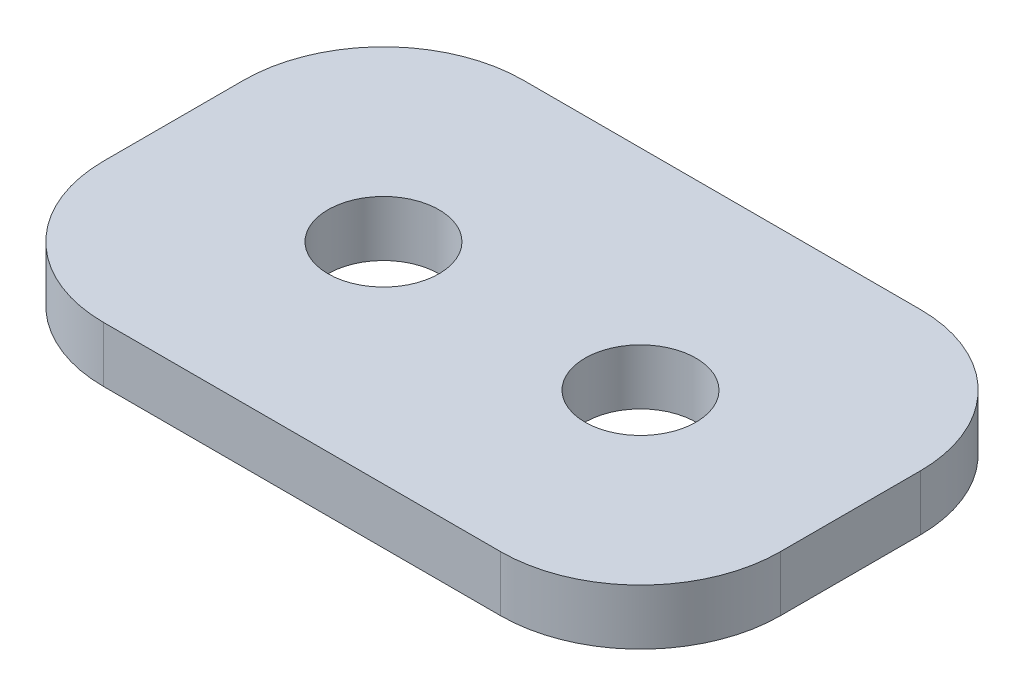
ISO-10303-21;
HEADER;
FILE_DESCRIPTION(('STEP AP214'),'2;1');
FILE_NAME('part.step','',(''),(''),'','','');
FILE_SCHEMA(('AUTOMOTIVE_DESIGN { 1 0 10303 214 1 1 1 1 }'));
ENDSEC;
DATA;
#1=APPLICATION_CONTEXT('core data for automotive mechanical design processes');
#2=APPLICATION_PROTOCOL_DEFINITION('international standard','automotive_design',2000,#1);
#3=PRODUCT_CONTEXT('',#1,'mechanical');
#4=PRODUCT('Part','Part','',(#3));
#5=PRODUCT_RELATED_PRODUCT_CATEGORY('part','',(#4));
#6=PRODUCT_DEFINITION_FORMATION('','',#4);
#7=PRODUCT_DEFINITION_CONTEXT('part definition',#1,'design');
#8=PRODUCT_DEFINITION('design','',#6,#7);
#9=PRODUCT_DEFINITION_SHAPE('','',#8);
#10=(LENGTH_UNIT() NAMED_UNIT(*) SI_UNIT(.MILLI.,.METRE.));
#11=(NAMED_UNIT(*) PLANE_ANGLE_UNIT() SI_UNIT($,.RADIAN.));
#12=(NAMED_UNIT(*) SI_UNIT($,.STERADIAN.) SOLID_ANGLE_UNIT());
#13=UNCERTAINTY_MEASURE_WITH_UNIT(LENGTH_MEASURE(1.E-05),#10,'distance_accuracy_value','');
#14=(GEOMETRIC_REPRESENTATION_CONTEXT(3) GLOBAL_UNCERTAINTY_ASSIGNED_CONTEXT((#13)) GLOBAL_UNIT_ASSIGNED_CONTEXT((#10,
#11,#12)) REPRESENTATION_CONTEXT('',''));
#15=CARTESIAN_POINT('',(0.,0.,0.));
#16=DIRECTION('',(0.,0.,1.));
#17=DIRECTION('',(1.,0.,0.));
#18=AXIS2_PLACEMENT_3D('',#15,#16,#17);
#19=CARTESIAN_POINT('',(0.,0.79375,0.));
#20=DIRECTION('',(0.,1.,0.));
#21=DIRECTION('',(0.,0.,1.));
#22=AXIS2_PLACEMENT_3D('',#19,#20,#21);
#23=PLANE('',#22);
#24=CARTESIAN_POINT('',(-3.675,0.79375,0.));
#25=DIRECTION('',(0.,1.,0.));
#26=DIRECTION('',(0.,0.,1.));
#27=AXIS2_PLACEMENT_3D('',#24,#25,#26);
#28=CIRCLE('',#27,1.5875);
#29=CARTESIAN_POINT('',(-3.675,0.79375,1.5875));
#30=VERTEX_POINT('',#29);
#31=EDGE_CURVE('E126',#30,#30,#28,.T.);
#32=ORIENTED_EDGE('',*,*,#31,.F.);
#33=EDGE_LOOP('',(#32));
#34=FACE_BOUND('',#33,.T.);
#35=DIRECTION('',(-1.,0.,0.));
#36=VECTOR('',#35,1.);
#37=CARTESIAN_POINT('',(9.675,0.79375,-6.));
#38=LINE('',#37,#36);
#39=CARTESIAN_POINT('',(5.675,0.79375,-6.));
#40=VERTEX_POINT('',#39);
#41=CARTESIAN_POINT('',(-5.675,0.79375,-6.));
#42=VERTEX_POINT('',#41);
#43=EDGE_CURVE('E135',#40,#42,#38,.T.);
#44=ORIENTED_EDGE('',*,*,#43,.T.);
#45=CARTESIAN_POINT('',(-5.675,0.79375,-2.));
#46=DIRECTION('',(0.,1.,0.));
#47=DIRECTION('',(0.,0.,1.));
#48=AXIS2_PLACEMENT_3D('',#45,#46,#47);
#49=CIRCLE('',#48,4.);
#50=CARTESIAN_POINT('',(-9.675,0.79375,-2.));
#51=VERTEX_POINT('',#50);
#52=EDGE_CURVE('E154',#42,#51,#49,.T.);
#53=ORIENTED_EDGE('',*,*,#52,.T.);
#54=DIRECTION('',(0.,0.,1.));
#55=VECTOR('',#54,1.);
#56=CARTESIAN_POINT('',(-9.675,0.79375,6.));
#57=LINE('',#56,#55);
#58=CARTESIAN_POINT('',(-9.675,0.79375,2.));
#59=VERTEX_POINT('',#58);
#60=EDGE_CURVE('E118',#51,#59,#57,.T.);
#61=ORIENTED_EDGE('',*,*,#60,.T.);
#62=CARTESIAN_POINT('',(-5.675,0.79375,2.));
#63=DIRECTION('',(0.,1.,0.));
#64=DIRECTION('',(0.,0.,1.));
#65=AXIS2_PLACEMENT_3D('',#62,#63,#64);
#66=CIRCLE('',#65,4.);
#67=CARTESIAN_POINT('',(-5.675,0.79375,6.));
#68=VERTEX_POINT('',#67);
#69=EDGE_CURVE('E152',#59,#68,#66,.T.);
#70=ORIENTED_EDGE('',*,*,#69,.T.);
#71=DIRECTION('',(1.,0.,0.));
#72=VECTOR('',#71,1.);
#73=CARTESIAN_POINT('',(9.675,0.79375,6.));
#74=LINE('',#73,#72);
#75=CARTESIAN_POINT('',(5.675,0.79375,6.));
#76=VERTEX_POINT('',#75);
#77=EDGE_CURVE('E174',#68,#76,#74,.T.);
#78=ORIENTED_EDGE('',*,*,#77,.T.);
#79=CARTESIAN_POINT('',(5.675,0.79375,2.));
#80=DIRECTION('',(0.,1.,0.));
#81=DIRECTION('',(0.,0.,1.));
#82=AXIS2_PLACEMENT_3D('',#79,#80,#81);
#83=CIRCLE('',#82,4.);
#84=CARTESIAN_POINT('',(9.675,0.79375,2.));
#85=VERTEX_POINT('',#84);
#86=EDGE_CURVE('E53',#76,#85,#83,.T.);
#87=ORIENTED_EDGE('',*,*,#86,.T.);
#88=DIRECTION('',(0.,0.,-1.));
#89=VECTOR('',#88,1.);
#90=CARTESIAN_POINT('',(9.675,0.79375,6.));
#91=LINE('',#90,#89);
#92=CARTESIAN_POINT('',(9.675,0.79375,-2.));
#93=VERTEX_POINT('',#92);
#94=EDGE_CURVE('E164',#85,#93,#91,.T.);
#95=ORIENTED_EDGE('',*,*,#94,.T.);
#96=CARTESIAN_POINT('',(5.675,0.79375,-2.));
#97=DIRECTION('',(0.,1.,0.));
#98=DIRECTION('',(0.,0.,1.));
#99=AXIS2_PLACEMENT_3D('',#96,#97,#98);
#100=CIRCLE('',#99,4.);
#101=EDGE_CURVE('E150',#93,#40,#100,.T.);
#102=ORIENTED_EDGE('',*,*,#101,.T.);
#103=EDGE_LOOP('',(#44,#53,#61,#70,#78,#87,#95,#102));
#104=FACE_BOUND('',#103,.T.);
#105=CARTESIAN_POINT('',(3.675,0.79375,0.));
#106=DIRECTION('',(0.,1.,0.));
#107=DIRECTION('',(0.,0.,1.));
#108=AXIS2_PLACEMENT_3D('',#105,#106,#107);
#109=CIRCLE('',#108,1.5875);
#110=CARTESIAN_POINT('',(3.675,0.79375,1.5875));
#111=VERTEX_POINT('',#110);
#112=EDGE_CURVE('E179',#111,#111,#109,.T.);
#113=ORIENTED_EDGE('',*,*,#112,.F.);
#114=EDGE_LOOP('',(#113));
#115=FACE_BOUND('',#114,.T.);
#116=ADVANCED_FACE('F33',(#34,#104,#115),#23,.T.);
#117=CARTESIAN_POINT('',(0.,-0.79375,0.));
#118=DIRECTION('',(0.,1.,0.));
#119=DIRECTION('',(0.,0.,1.));
#120=AXIS2_PLACEMENT_3D('',#117,#118,#119);
#121=PLANE('',#120);
#122=CARTESIAN_POINT('',(-3.675,-0.79375,0.));
#123=DIRECTION('',(0.,1.,0.));
#124=DIRECTION('',(0.,0.,1.));
#125=AXIS2_PLACEMENT_3D('',#122,#123,#124);
#126=CIRCLE('',#125,1.5875);
#127=CARTESIAN_POINT('',(-3.675,-0.79375,1.5875));
#128=VERTEX_POINT('',#127);
#129=EDGE_CURVE('E132',#128,#128,#126,.T.);
#130=ORIENTED_EDGE('',*,*,#129,.T.);
#131=EDGE_LOOP('',(#130));
#132=FACE_BOUND('',#131,.T.);
#133=DIRECTION('',(0.,0.,1.));
#134=VECTOR('',#133,1.);
#135=CARTESIAN_POINT('',(-9.675,-0.79375,6.));
#136=LINE('',#135,#134);
#137=CARTESIAN_POINT('',(-9.675,-0.79375,-2.));
#138=VERTEX_POINT('',#137);
#139=CARTESIAN_POINT('',(-9.675,-0.79375,2.));
#140=VERTEX_POINT('',#139);
#141=EDGE_CURVE('E115',#138,#140,#136,.T.);
#142=ORIENTED_EDGE('',*,*,#141,.F.);
#143=CARTESIAN_POINT('',(-5.675,-0.79375,-2.));
#144=DIRECTION('',(0.,1.,0.));
#145=DIRECTION('',(0.,0.,1.));
#146=AXIS2_PLACEMENT_3D('',#143,#144,#145);
#147=CIRCLE('',#146,4.);
#148=CARTESIAN_POINT('',(-5.675,-0.79375,-6.));
#149=VERTEX_POINT('',#148);
#150=EDGE_CURVE('E98',#138,#149,#147,.F.);
#151=ORIENTED_EDGE('',*,*,#150,.T.);
#152=DIRECTION('',(-1.,0.,0.));
#153=VECTOR('',#152,1.);
#154=CARTESIAN_POINT('',(9.675,-0.79375,-6.));
#155=LINE('',#154,#153);
#156=CARTESIAN_POINT('',(5.675,-0.79375,-6.));
#157=VERTEX_POINT('',#156);
#158=EDGE_CURVE('E139',#157,#149,#155,.T.);
#159=ORIENTED_EDGE('',*,*,#158,.F.);
#160=CARTESIAN_POINT('',(5.675,-0.79375,-2.));
#161=DIRECTION('',(0.,1.,0.));
#162=DIRECTION('',(0.,0.,1.));
#163=AXIS2_PLACEMENT_3D('',#160,#161,#162);
#164=CIRCLE('',#163,4.);
#165=CARTESIAN_POINT('',(9.675,-0.79375,-2.));
#166=VERTEX_POINT('',#165);
#167=EDGE_CURVE('E143',#157,#166,#164,.F.);
#168=ORIENTED_EDGE('',*,*,#167,.T.);
#169=DIRECTION('',(0.,0.,-1.));
#170=VECTOR('',#169,1.);
#171=CARTESIAN_POINT('',(9.675,-0.79375,6.));
#172=LINE('',#171,#170);
#173=CARTESIAN_POINT('',(9.675,-0.79375,2.));
#174=VERTEX_POINT('',#173);
#175=EDGE_CURVE('E129',#174,#166,#172,.T.);
#176=ORIENTED_EDGE('',*,*,#175,.F.);
#177=CARTESIAN_POINT('',(5.675,-0.79375,2.));
#178=DIRECTION('',(0.,1.,0.));
#179=DIRECTION('',(0.,0.,1.));
#180=AXIS2_PLACEMENT_3D('',#177,#178,#179);
#181=CIRCLE('',#180,4.);
#182=CARTESIAN_POINT('',(5.675,-0.79375,6.));
#183=VERTEX_POINT('',#182);
#184=EDGE_CURVE('E119',#174,#183,#181,.F.);
#185=ORIENTED_EDGE('',*,*,#184,.T.);
#186=DIRECTION('',(1.,0.,0.));
#187=VECTOR('',#186,1.);
#188=CARTESIAN_POINT('',(9.675,-0.79375,6.));
#189=LINE('',#188,#187);
#190=CARTESIAN_POINT('',(-5.675,-0.79375,6.));
#191=VERTEX_POINT('',#190);
#192=EDGE_CURVE('E125',#191,#183,#189,.T.);
#193=ORIENTED_EDGE('',*,*,#192,.F.);
#194=CARTESIAN_POINT('',(-5.675,-0.79375,2.));
#195=DIRECTION('',(0.,1.,0.));
#196=DIRECTION('',(0.,0.,1.));
#197=AXIS2_PLACEMENT_3D('',#194,#195,#196);
#198=CIRCLE('',#197,4.);
#199=EDGE_CURVE('E109',#191,#140,#198,.F.);
#200=ORIENTED_EDGE('',*,*,#199,.T.);
#201=EDGE_LOOP('',(#142,#151,#159,#168,#176,#185,#193,#200));
#202=FACE_BOUND('',#201,.T.);
#203=CARTESIAN_POINT('',(3.675,-0.79375,0.));
#204=DIRECTION('',(0.,1.,0.));
#205=DIRECTION('',(0.,0.,1.));
#206=AXIS2_PLACEMENT_3D('',#203,#204,#205);
#207=CIRCLE('',#206,1.5875);
#208=CARTESIAN_POINT('',(3.675,-0.79375,1.5875));
#209=VERTEX_POINT('',#208);
#210=EDGE_CURVE('E181',#209,#209,#207,.T.);
#211=ORIENTED_EDGE('',*,*,#210,.T.);
#212=EDGE_LOOP('',(#211));
#213=FACE_BOUND('',#212,.T.);
#214=ADVANCED_FACE('F122',(#132,#202,#213),#121,.F.);
#215=CARTESIAN_POINT('',(-9.675,0.79375,6.));
#216=DIRECTION('',(1.,0.,0.));
#217=DIRECTION('',(0.,0.,-1.));
#218=AXIS2_PLACEMENT_3D('',#215,#216,#217);
#219=PLANE('',#218);
#220=ORIENTED_EDGE('',*,*,#60,.F.);
#221=DIRECTION('',(0.,-1.,0.));
#222=VECTOR('',#221,1.);
#223=CARTESIAN_POINT('',(-9.675,0.79375,-2.));
#224=LINE('',#223,#222);
#225=EDGE_CURVE('E102',#51,#138,#224,.T.);
#226=ORIENTED_EDGE('',*,*,#225,.T.);
#227=ORIENTED_EDGE('',*,*,#141,.T.);
#228=DIRECTION('',(0.,-1.,0.));
#229=VECTOR('',#228,1.);
#230=CARTESIAN_POINT('',(-9.675,0.79375,2.));
#231=LINE('',#230,#229);
#232=EDGE_CURVE('E120',#140,#59,#231,.F.);
#233=ORIENTED_EDGE('',*,*,#232,.T.);
#234=EDGE_LOOP('',(#220,#226,#227,#233));
#235=FACE_BOUND('',#234,.T.);
#236=ADVANCED_FACE('F114',(#235),#219,.F.);
#237=CARTESIAN_POINT('',(9.675,0.79375,6.));
#238=DIRECTION('',(0.,0.,-1.));
#239=DIRECTION('',(-1.,0.,0.));
#240=AXIS2_PLACEMENT_3D('',#237,#238,#239);
#241=PLANE('',#240);
#242=ORIENTED_EDGE('',*,*,#77,.F.);
#243=DIRECTION('',(0.,-1.,0.));
#244=VECTOR('',#243,1.);
#245=CARTESIAN_POINT('',(-5.675,0.79375,6.));
#246=LINE('',#245,#244);
#247=EDGE_CURVE('E158',#68,#191,#246,.T.);
#248=ORIENTED_EDGE('',*,*,#247,.T.);
#249=ORIENTED_EDGE('',*,*,#192,.T.);
#250=DIRECTION('',(0.,-1.,0.));
#251=VECTOR('',#250,1.);
#252=CARTESIAN_POINT('',(5.675,0.79375,6.));
#253=LINE('',#252,#251);
#254=EDGE_CURVE('E156',#183,#76,#253,.F.);
#255=ORIENTED_EDGE('',*,*,#254,.T.);
#256=EDGE_LOOP('',(#242,#248,#249,#255));
#257=FACE_BOUND('',#256,.T.);
#258=ADVANCED_FACE('F208',(#257),#241,.F.);
#259=CARTESIAN_POINT('',(9.675,0.79375,6.));
#260=DIRECTION('',(-1.,0.,0.));
#261=DIRECTION('',(0.,0.,1.));
#262=AXIS2_PLACEMENT_3D('',#259,#260,#261);
#263=PLANE('',#262);
#264=ORIENTED_EDGE('',*,*,#175,.T.);
#265=DIRECTION('',(0.,-1.,0.));
#266=VECTOR('',#265,1.);
#267=CARTESIAN_POINT('',(9.675,0.79375,-2.));
#268=LINE('',#267,#266);
#269=EDGE_CURVE('E11',#166,#93,#268,.F.);
#270=ORIENTED_EDGE('',*,*,#269,.T.);
#271=ORIENTED_EDGE('',*,*,#94,.F.);
#272=DIRECTION('',(0.,-1.,0.));
#273=VECTOR('',#272,1.);
#274=CARTESIAN_POINT('',(9.675,0.79375,2.));
#275=LINE('',#274,#273);
#276=EDGE_CURVE('E41',#85,#174,#275,.T.);
#277=ORIENTED_EDGE('',*,*,#276,.T.);
#278=EDGE_LOOP('',(#264,#270,#271,#277));
#279=FACE_BOUND('',#278,.T.);
#280=ADVANCED_FACE('F163',(#279),#263,.F.);
#281=CARTESIAN_POINT('',(9.675,0.79375,-6.));
#282=DIRECTION('',(0.,0.,1.));
#283=DIRECTION('',(1.,0.,0.));
#284=AXIS2_PLACEMENT_3D('',#281,#282,#283);
#285=PLANE('',#284);
#286=ORIENTED_EDGE('',*,*,#158,.T.);
#287=DIRECTION('',(0.,-1.,0.));
#288=VECTOR('',#287,1.);
#289=CARTESIAN_POINT('',(-5.675,0.79375,-6.));
#290=LINE('',#289,#288);
#291=EDGE_CURVE('E103',#149,#42,#290,.F.);
#292=ORIENTED_EDGE('',*,*,#291,.T.);
#293=ORIENTED_EDGE('',*,*,#43,.F.);
#294=DIRECTION('',(0.,-1.,0.));
#295=VECTOR('',#294,1.);
#296=CARTESIAN_POINT('',(5.675,0.79375,-6.));
#297=LINE('',#296,#295);
#298=EDGE_CURVE('E108',#40,#157,#297,.T.);
#299=ORIENTED_EDGE('',*,*,#298,.T.);
#300=EDGE_LOOP('',(#286,#292,#293,#299));
#301=FACE_BOUND('',#300,.T.);
#302=ADVANCED_FACE('F172',(#301),#285,.F.);
#303=CARTESIAN_POINT('',(-3.675,0.79375,0.));
#304=DIRECTION('',(0.,-1.,0.));
#305=DIRECTION('',(0.,0.,-1.));
#306=AXIS2_PLACEMENT_3D('',#303,#304,#305);
#307=CYLINDRICAL_SURFACE('',#306,1.5875);
#308=ORIENTED_EDGE('',*,*,#31,.T.);
#309=EDGE_LOOP('',(#308));
#310=FACE_BOUND('',#309,.T.);
#311=ORIENTED_EDGE('',*,*,#129,.F.);
#312=EDGE_LOOP('',(#311));
#313=FACE_BOUND('',#312,.T.);
#314=ADVANCED_FACE('F201',(#310,#313),#307,.F.);
#315=CARTESIAN_POINT('',(3.675,0.79375,0.));
#316=DIRECTION('',(0.,-1.,0.));
#317=DIRECTION('',(0.,0.,-1.));
#318=AXIS2_PLACEMENT_3D('',#315,#316,#317);
#319=CYLINDRICAL_SURFACE('',#318,1.5875);
#320=ORIENTED_EDGE('',*,*,#112,.T.);
#321=EDGE_LOOP('',(#320));
#322=FACE_BOUND('',#321,.T.);
#323=ORIENTED_EDGE('',*,*,#210,.F.);
#324=EDGE_LOOP('',(#323));
#325=FACE_BOUND('',#324,.T.);
#326=ADVANCED_FACE('F187',(#322,#325),#319,.F.);
#327=CARTESIAN_POINT('',(-5.675,0.79375,-2.));
#328=DIRECTION('',(0.,-1.,0.));
#329=DIRECTION('',(0.,0.,-1.));
#330=AXIS2_PLACEMENT_3D('',#327,#328,#329);
#331=CYLINDRICAL_SURFACE('',#330,4.);
#332=ORIENTED_EDGE('',*,*,#52,.F.);
#333=ORIENTED_EDGE('',*,*,#291,.F.);
#334=ORIENTED_EDGE('',*,*,#150,.F.);
#335=ORIENTED_EDGE('',*,*,#225,.F.);
#336=EDGE_LOOP('',(#332,#333,#334,#335));
#337=FACE_BOUND('',#336,.T.);
#338=ADVANCED_FACE('F101',(#337),#331,.T.);
#339=CARTESIAN_POINT('',(-5.675,0.79375,2.));
#340=DIRECTION('',(0.,-1.,0.));
#341=DIRECTION('',(0.,0.,-1.));
#342=AXIS2_PLACEMENT_3D('',#339,#340,#341);
#343=CYLINDRICAL_SURFACE('',#342,4.);
#344=ORIENTED_EDGE('',*,*,#69,.F.);
#345=ORIENTED_EDGE('',*,*,#232,.F.);
#346=ORIENTED_EDGE('',*,*,#199,.F.);
#347=ORIENTED_EDGE('',*,*,#247,.F.);
#348=EDGE_LOOP('',(#344,#345,#346,#347));
#349=FACE_BOUND('',#348,.T.);
#350=ADVANCED_FACE('F216',(#349),#343,.T.);
#351=CARTESIAN_POINT('',(5.675,0.79375,-2.));
#352=DIRECTION('',(0.,-1.,0.));
#353=DIRECTION('',(0.,0.,-1.));
#354=AXIS2_PLACEMENT_3D('',#351,#352,#353);
#355=CYLINDRICAL_SURFACE('',#354,4.);
#356=ORIENTED_EDGE('',*,*,#101,.F.);
#357=ORIENTED_EDGE('',*,*,#269,.F.);
#358=ORIENTED_EDGE('',*,*,#167,.F.);
#359=ORIENTED_EDGE('',*,*,#298,.F.);
#360=EDGE_LOOP('',(#356,#357,#358,#359));
#361=FACE_BOUND('',#360,.T.);
#362=ADVANCED_FACE('F169',(#361),#355,.T.);
#363=CARTESIAN_POINT('',(5.675,0.79375,2.));
#364=DIRECTION('',(0.,-1.,0.));
#365=DIRECTION('',(0.,0.,-1.));
#366=AXIS2_PLACEMENT_3D('',#363,#364,#365);
#367=CYLINDRICAL_SURFACE('',#366,4.);
#368=ORIENTED_EDGE('',*,*,#86,.F.);
#369=ORIENTED_EDGE('',*,*,#254,.F.);
#370=ORIENTED_EDGE('',*,*,#184,.F.);
#371=ORIENTED_EDGE('',*,*,#276,.F.);
#372=EDGE_LOOP('',(#368,#369,#370,#371));
#373=FACE_BOUND('',#372,.T.);
#374=ADVANCED_FACE('F35',(#373),#367,.T.);
#375=CLOSED_SHELL('',(#116,#214,#236,#258,#280,#302,#314,#326,#338,#350,#362,#374));
#376=MANIFOLD_SOLID_BREP('B2',#375);
#377=ADVANCED_BREP_SHAPE_REPRESENTATION('',(#18,#376),#14);
#378=SHAPE_DEFINITION_REPRESENTATION(#9,#377);
ENDSEC;
END-ISO-10303-21;
